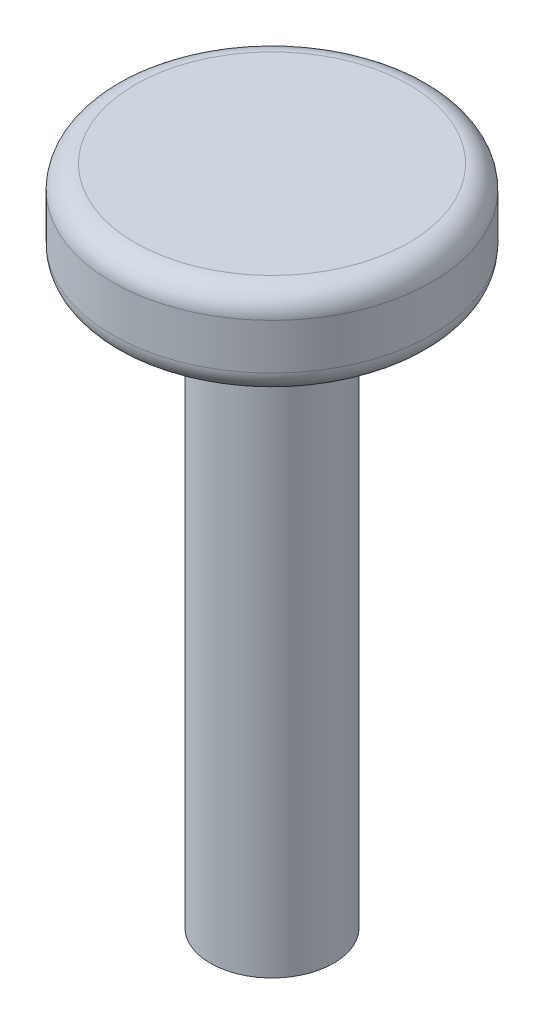
ISO-10303-21;
HEADER;
FILE_DESCRIPTION(('STEP AP214'),'2;1');
FILE_NAME('part.step','',(''),(''),'','','');
FILE_SCHEMA(('AUTOMOTIVE_DESIGN { 1 0 10303 214 1 1 1 1 }'));
ENDSEC;
DATA;
#1=APPLICATION_CONTEXT('core data for automotive mechanical design processes');
#2=APPLICATION_PROTOCOL_DEFINITION('international standard','automotive_design',2000,#1);
#3=PRODUCT_CONTEXT('',#1,'mechanical');
#4=PRODUCT('Part','Part','',(#3));
#5=PRODUCT_RELATED_PRODUCT_CATEGORY('part','',(#4));
#6=PRODUCT_DEFINITION_FORMATION('','',#4);
#7=PRODUCT_DEFINITION_CONTEXT('part definition',#1,'design');
#8=PRODUCT_DEFINITION('design','',#6,#7);
#9=PRODUCT_DEFINITION_SHAPE('','',#8);
#10=(LENGTH_UNIT() NAMED_UNIT(*) SI_UNIT(.MILLI.,.METRE.));
#11=(NAMED_UNIT(*) PLANE_ANGLE_UNIT() SI_UNIT($,.RADIAN.));
#12=(NAMED_UNIT(*) SI_UNIT($,.STERADIAN.) SOLID_ANGLE_UNIT());
#13=UNCERTAINTY_MEASURE_WITH_UNIT(LENGTH_MEASURE(1.E-05),#10,'distance_accuracy_value','');
#14=(GEOMETRIC_REPRESENTATION_CONTEXT(3) GLOBAL_UNCERTAINTY_ASSIGNED_CONTEXT((#13)) GLOBAL_UNIT_ASSIGNED_CONTEXT((#10,
#11,#12)) REPRESENTATION_CONTEXT('',''));
#15=CARTESIAN_POINT('',(0.,0.,0.));
#16=DIRECTION('',(0.,0.,1.));
#17=DIRECTION('',(1.,0.,0.));
#18=AXIS2_PLACEMENT_3D('',#15,#16,#17);
#19=CARTESIAN_POINT('',(0.,12.5,0.));
#20=DIRECTION('',(0.,-1.,0.));
#21=DIRECTION('',(0.,0.,-1.));
#22=AXIS2_PLACEMENT_3D('',#19,#20,#21);
#23=CYLINDRICAL_SURFACE('',#22,1.35);
#24=CARTESIAN_POINT('',(0.,12.5,0.));
#25=DIRECTION('',(0.,1.,0.));
#26=DIRECTION('',(0.,0.,1.));
#27=AXIS2_PLACEMENT_3D('',#24,#25,#26);
#28=CIRCLE('',#27,1.35);
#29=CARTESIAN_POINT('',(0.,12.5,1.35));
#30=VERTEX_POINT('',#29);
#31=EDGE_CURVE('E51',#30,#30,#28,.T.);
#32=ORIENTED_EDGE('',*,*,#31,.F.);
#33=EDGE_LOOP('',(#32));
#34=FACE_BOUND('',#33,.T.);
#35=CARTESIAN_POINT('',(0.,0.,0.));
#36=DIRECTION('',(0.,1.,0.));
#37=DIRECTION('',(0.,0.,1.));
#38=AXIS2_PLACEMENT_3D('',#35,#36,#37);
#39=CIRCLE('',#38,1.35);
#40=CARTESIAN_POINT('',(0.,0.,1.35));
#41=VERTEX_POINT('',#40);
#42=EDGE_CURVE('E52',#41,#41,#39,.T.);
#43=ORIENTED_EDGE('',*,*,#42,.T.);
#44=EDGE_LOOP('',(#43));
#45=FACE_BOUND('',#44,.T.);
#46=ADVANCED_FACE('F31',(#34,#45),#23,.T.);
#47=CARTESIAN_POINT('',(0.,0.,0.));
#48=DIRECTION('',(0.,1.,0.));
#49=DIRECTION('',(0.,0.,1.));
#50=AXIS2_PLACEMENT_3D('',#47,#48,#49);
#51=PLANE('',#50);
#52=ORIENTED_EDGE('',*,*,#42,.F.);
#53=EDGE_LOOP('',(#52));
#54=FACE_BOUND('',#53,.T.);
#55=ADVANCED_FACE('F62',(#54),#51,.F.);
#56=CARTESIAN_POINT('',(0.,14.5,0.));
#57=DIRECTION('',(0.,-1.,0.));
#58=DIRECTION('',(0.,0.,-1.));
#59=AXIS2_PLACEMENT_3D('',#56,#57,#58);
#60=CYLINDRICAL_SURFACE('',#59,3.5);
#61=CARTESIAN_POINT('',(0.,13.,0.));
#62=DIRECTION('',(0.,1.,0.));
#63=DIRECTION('',(0.,0.,1.));
#64=AXIS2_PLACEMENT_3D('',#61,#62,#63);
#65=CIRCLE('',#64,3.5);
#66=CARTESIAN_POINT('',(0.,13.,3.5));
#67=VERTEX_POINT('',#66);
#68=EDGE_CURVE('E42',#67,#67,#65,.T.);
#69=ORIENTED_EDGE('',*,*,#68,.T.);
#70=EDGE_LOOP('',(#69));
#71=FACE_BOUND('',#70,.T.);
#72=CARTESIAN_POINT('',(0.,14.,0.));
#73=DIRECTION('',(0.,1.,0.));
#74=DIRECTION('',(0.,0.,1.));
#75=AXIS2_PLACEMENT_3D('',#72,#73,#74);
#76=CIRCLE('',#75,3.5);
#77=CARTESIAN_POINT('',(0.,14.,3.5));
#78=VERTEX_POINT('',#77);
#79=EDGE_CURVE('E46',#78,#78,#76,.F.);
#80=ORIENTED_EDGE('',*,*,#79,.T.);
#81=EDGE_LOOP('',(#80));
#82=FACE_BOUND('',#81,.T.);
#83=ADVANCED_FACE('F67',(#71,#82),#60,.T.);
#84=CARTESIAN_POINT('',(0.,14.5,0.));
#85=DIRECTION('',(0.,1.,0.));
#86=DIRECTION('',(0.,0.,1.));
#87=AXIS2_PLACEMENT_3D('',#84,#85,#86);
#88=PLANE('',#87);
#89=CARTESIAN_POINT('',(0.,14.5,0.));
#90=DIRECTION('',(0.,1.,0.));
#91=DIRECTION('',(0.,0.,1.));
#92=AXIS2_PLACEMENT_3D('',#89,#90,#91);
#93=CIRCLE('',#92,3.);
#94=CARTESIAN_POINT('',(0.,14.5,3.));
#95=VERTEX_POINT('',#94);
#96=EDGE_CURVE('E10',#95,#95,#93,.T.);
#97=ORIENTED_EDGE('',*,*,#96,.T.);
#98=EDGE_LOOP('',(#97));
#99=FACE_BOUND('',#98,.T.);
#100=ADVANCED_FACE('F72',(#99),#88,.T.);
#101=CARTESIAN_POINT('',(0.,12.5,0.));
#102=DIRECTION('',(0.,1.,0.));
#103=DIRECTION('',(0.,0.,1.));
#104=AXIS2_PLACEMENT_3D('',#101,#102,#103);
#105=PLANE('',#104);
#106=CARTESIAN_POINT('',(0.,12.5,0.));
#107=DIRECTION('',(0.,1.,0.));
#108=DIRECTION('',(0.,0.,1.));
#109=AXIS2_PLACEMENT_3D('',#106,#107,#108);
#110=CIRCLE('',#109,3.);
#111=CARTESIAN_POINT('',(0.,12.5,3.));
#112=VERTEX_POINT('',#111);
#113=EDGE_CURVE('E38',#112,#112,#110,.F.);
#114=ORIENTED_EDGE('',*,*,#113,.T.);
#115=EDGE_LOOP('',(#114));
#116=FACE_BOUND('',#115,.T.);
#117=ORIENTED_EDGE('',*,*,#31,.T.);
#118=EDGE_LOOP('',(#117));
#119=FACE_BOUND('',#118,.T.);
#120=ADVANCED_FACE('F58',(#116,#119),#105,.F.);
#121=CARTESIAN_POINT('',(0.,13.,0.));
#122=DIRECTION('',(0.,1.,0.));
#123=DIRECTION('',(0.,0.,1.));
#124=AXIS2_PLACEMENT_3D('',#121,#122,#123);
#125=TOROIDAL_SURFACE('',#124,3.,0.5);
#126=ORIENTED_EDGE('',*,*,#113,.F.);
#127=EDGE_LOOP('',(#126));
#128=FACE_BOUND('',#127,.T.);
#129=ORIENTED_EDGE('',*,*,#68,.F.);
#130=EDGE_LOOP('',(#129));
#131=FACE_BOUND('',#130,.T.);
#132=ADVANCED_FACE('F76',(#128,#131),#125,.T.);
#133=CARTESIAN_POINT('',(0.,14.,0.));
#134=DIRECTION('',(0.,1.,0.));
#135=DIRECTION('',(0.,0.,1.));
#136=AXIS2_PLACEMENT_3D('',#133,#134,#135);
#137=TOROIDAL_SURFACE('',#136,3.,0.5);
#138=ORIENTED_EDGE('',*,*,#79,.F.);
#139=EDGE_LOOP('',(#138));
#140=FACE_BOUND('',#139,.T.);
#141=ORIENTED_EDGE('',*,*,#96,.F.);
#142=EDGE_LOOP('',(#141));
#143=FACE_BOUND('',#142,.T.);
#144=ADVANCED_FACE('F33',(#140,#143),#137,.T.);
#145=CLOSED_SHELL('',(#46,#55,#83,#100,#120,#132,#144));
#146=MANIFOLD_SOLID_BREP('B2',#145);
#147=ADVANCED_BREP_SHAPE_REPRESENTATION('',(#18,#146),#14);
#148=SHAPE_DEFINITION_REPRESENTATION(#9,#147);
ENDSEC;
END-ISO-10303-21;
